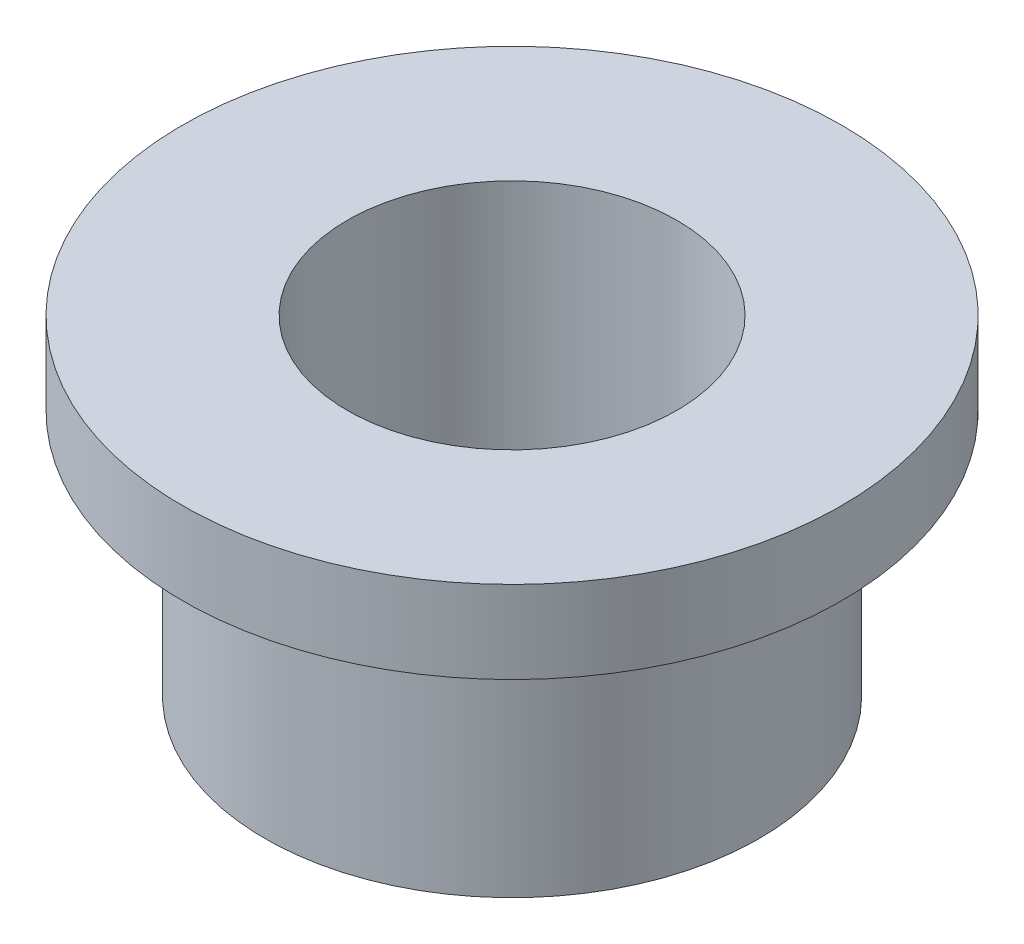
ISO-10303-21;
HEADER;
FILE_DESCRIPTION(('STEP AP214'),'2;1');
FILE_NAME('part.step','',(''),(''),'','','');
FILE_SCHEMA(('AUTOMOTIVE_DESIGN { 1 0 10303 214 1 1 1 1 }'));
ENDSEC;
DATA;
#1=APPLICATION_CONTEXT('core data for automotive mechanical design processes');
#2=APPLICATION_PROTOCOL_DEFINITION('international standard','automotive_design',2000,#1);
#3=PRODUCT_CONTEXT('',#1,'mechanical');
#4=PRODUCT('Part','Part','',(#3));
#5=PRODUCT_RELATED_PRODUCT_CATEGORY('part','',(#4));
#6=PRODUCT_DEFINITION_FORMATION('','',#4);
#7=PRODUCT_DEFINITION_CONTEXT('part definition',#1,'design');
#8=PRODUCT_DEFINITION('design','',#6,#7);
#9=PRODUCT_DEFINITION_SHAPE('','',#8);
#10=(LENGTH_UNIT() NAMED_UNIT(*) SI_UNIT(.MILLI.,.METRE.));
#11=(NAMED_UNIT(*) PLANE_ANGLE_UNIT() SI_UNIT($,.RADIAN.));
#12=(NAMED_UNIT(*) SI_UNIT($,.STERADIAN.) SOLID_ANGLE_UNIT());
#13=UNCERTAINTY_MEASURE_WITH_UNIT(LENGTH_MEASURE(1.E-05),#10,'distance_accuracy_value','');
#14=(GEOMETRIC_REPRESENTATION_CONTEXT(3) GLOBAL_UNCERTAINTY_ASSIGNED_CONTEXT((#13)) GLOBAL_UNIT_ASSIGNED_CONTEXT((#10,
#11,#12)) REPRESENTATION_CONTEXT('',''));
#15=CARTESIAN_POINT('',(0.,0.,0.));
#16=DIRECTION('',(0.,0.,1.));
#17=DIRECTION('',(1.,0.,0.));
#18=AXIS2_PLACEMENT_3D('',#15,#16,#17);
#19=CARTESIAN_POINT('',(9.525,0.,0.));
#20=DIRECTION('',(0.,-1.,0.));
#21=DIRECTION('',(0.,0.,-1.));
#22=AXIS2_PLACEMENT_3D('',#19,#20,#21);
#23=PLANE('',#22);
#24=CARTESIAN_POINT('',(0.,0.,0.));
#25=DIRECTION('',(0.,-1.,0.));
#26=DIRECTION('',(0.,0.,-1.));
#27=AXIS2_PLACEMENT_3D('',#24,#25,#26);
#28=CIRCLE('',#27,9.525);
#29=CARTESIAN_POINT('',(0.,0.,-9.525));
#30=VERTEX_POINT('',#29);
#31=EDGE_CURVE('E53',#30,#30,#28,.T.);
#32=ORIENTED_EDGE('',*,*,#31,.T.);
#33=EDGE_LOOP('',(#32));
#34=FACE_BOUND('',#33,.T.);
#35=CARTESIAN_POINT('',(0.,0.,0.));
#36=DIRECTION('',(0.,-1.,0.));
#37=DIRECTION('',(0.,0.,-1.));
#38=AXIS2_PLACEMENT_3D('',#35,#36,#37);
#39=CIRCLE('',#38,6.35);
#40=CARTESIAN_POINT('',(0.,0.,-6.35));
#41=VERTEX_POINT('',#40);
#42=EDGE_CURVE('E10',#41,#41,#39,.T.);
#43=ORIENTED_EDGE('',*,*,#42,.F.);
#44=EDGE_LOOP('',(#43));
#45=FACE_BOUND('',#44,.T.);
#46=ADVANCED_FACE('F31',(#34,#45),#23,.T.);
#47=CARTESIAN_POINT('',(0.,0.,0.));
#48=DIRECTION('',(0.,-1.,0.));
#49=DIRECTION('',(0.,0.,-1.));
#50=AXIS2_PLACEMENT_3D('',#47,#48,#49);
#51=CYLINDRICAL_SURFACE('',#50,6.35);
#52=ORIENTED_EDGE('',*,*,#42,.T.);
#53=EDGE_LOOP('',(#52));
#54=FACE_BOUND('',#53,.T.);
#55=CARTESIAN_POINT('',(0.,12.7,0.));
#56=DIRECTION('',(0.,-1.,0.));
#57=DIRECTION('',(0.,0.,-1.));
#58=AXIS2_PLACEMENT_3D('',#55,#56,#57);
#59=CIRCLE('',#58,6.35);
#60=CARTESIAN_POINT('',(0.,12.7,-6.35));
#61=VERTEX_POINT('',#60);
#62=EDGE_CURVE('E37',#61,#61,#59,.T.);
#63=ORIENTED_EDGE('',*,*,#62,.F.);
#64=EDGE_LOOP('',(#63));
#65=FACE_BOUND('',#64,.T.);
#66=ADVANCED_FACE('F71',(#54,#65),#51,.F.);
#67=CARTESIAN_POINT('',(6.35,12.7,0.));
#68=DIRECTION('',(0.,1.,0.));
#69=DIRECTION('',(0.,0.,1.));
#70=AXIS2_PLACEMENT_3D('',#67,#68,#69);
#71=PLANE('',#70);
#72=ORIENTED_EDGE('',*,*,#62,.T.);
#73=EDGE_LOOP('',(#72));
#74=FACE_BOUND('',#73,.T.);
#75=CARTESIAN_POINT('',(0.,12.7,0.));
#76=DIRECTION('',(0.,-1.,0.));
#77=DIRECTION('',(0.,0.,-1.));
#78=AXIS2_PLACEMENT_3D('',#75,#76,#77);
#79=CIRCLE('',#78,12.7);
#80=CARTESIAN_POINT('',(0.,12.7,-12.7));
#81=VERTEX_POINT('',#80);
#82=EDGE_CURVE('E41',#81,#81,#79,.T.);
#83=ORIENTED_EDGE('',*,*,#82,.F.);
#84=EDGE_LOOP('',(#83));
#85=FACE_BOUND('',#84,.T.);
#86=ADVANCED_FACE('F75',(#74,#85),#71,.T.);
#87=CARTESIAN_POINT('',(0.,0.,0.));
#88=DIRECTION('',(0.,-1.,0.));
#89=DIRECTION('',(0.,0.,-1.));
#90=AXIS2_PLACEMENT_3D('',#87,#88,#89);
#91=CYLINDRICAL_SURFACE('',#90,12.7);
#92=ORIENTED_EDGE('',*,*,#82,.T.);
#93=EDGE_LOOP('',(#92));
#94=FACE_BOUND('',#93,.T.);
#95=CARTESIAN_POINT('',(0.,9.525,0.));
#96=DIRECTION('',(0.,-1.,0.));
#97=DIRECTION('',(0.,0.,-1.));
#98=AXIS2_PLACEMENT_3D('',#95,#96,#97);
#99=CIRCLE('',#98,12.7);
#100=CARTESIAN_POINT('',(0.,9.525,-12.7));
#101=VERTEX_POINT('',#100);
#102=EDGE_CURVE('E45',#101,#101,#99,.T.);
#103=ORIENTED_EDGE('',*,*,#102,.F.);
#104=EDGE_LOOP('',(#103));
#105=FACE_BOUND('',#104,.T.);
#106=ADVANCED_FACE('F67',(#94,#105),#91,.T.);
#107=CARTESIAN_POINT('',(12.7,9.525,0.));
#108=DIRECTION('',(0.,-1.,0.));
#109=DIRECTION('',(0.,0.,-1.));
#110=AXIS2_PLACEMENT_3D('',#107,#108,#109);
#111=PLANE('',#110);
#112=ORIENTED_EDGE('',*,*,#102,.T.);
#113=EDGE_LOOP('',(#112));
#114=FACE_BOUND('',#113,.T.);
#115=CARTESIAN_POINT('',(0.,9.525,0.));
#116=DIRECTION('',(0.,-1.,0.));
#117=DIRECTION('',(0.,0.,-1.));
#118=AXIS2_PLACEMENT_3D('',#115,#116,#117);
#119=CIRCLE('',#118,9.525);
#120=CARTESIAN_POINT('',(0.,9.525,-9.525));
#121=VERTEX_POINT('',#120);
#122=EDGE_CURVE('E50',#121,#121,#119,.T.);
#123=ORIENTED_EDGE('',*,*,#122,.F.);
#124=EDGE_LOOP('',(#123));
#125=FACE_BOUND('',#124,.T.);
#126=ADVANCED_FACE('F61',(#114,#125),#111,.T.);
#127=CARTESIAN_POINT('',(0.,0.,0.));
#128=DIRECTION('',(0.,-1.,0.));
#129=DIRECTION('',(0.,0.,-1.));
#130=AXIS2_PLACEMENT_3D('',#127,#128,#129);
#131=CYLINDRICAL_SURFACE('',#130,9.525);
#132=ORIENTED_EDGE('',*,*,#122,.T.);
#133=EDGE_LOOP('',(#132));
#134=FACE_BOUND('',#133,.T.);
#135=ORIENTED_EDGE('',*,*,#31,.F.);
#136=EDGE_LOOP('',(#135));
#137=FACE_BOUND('',#136,.T.);
#138=ADVANCED_FACE('F59',(#134,#137),#131,.T.);
#139=CLOSED_SHELL('',(#46,#66,#86,#106,#126,#138));
#140=MANIFOLD_SOLID_BREP('B2',#139);
#141=ADVANCED_BREP_SHAPE_REPRESENTATION('',(#18,#140),#14);
#142=SHAPE_DEFINITION_REPRESENTATION(#9,#141);
ENDSEC;
END-ISO-10303-21;
